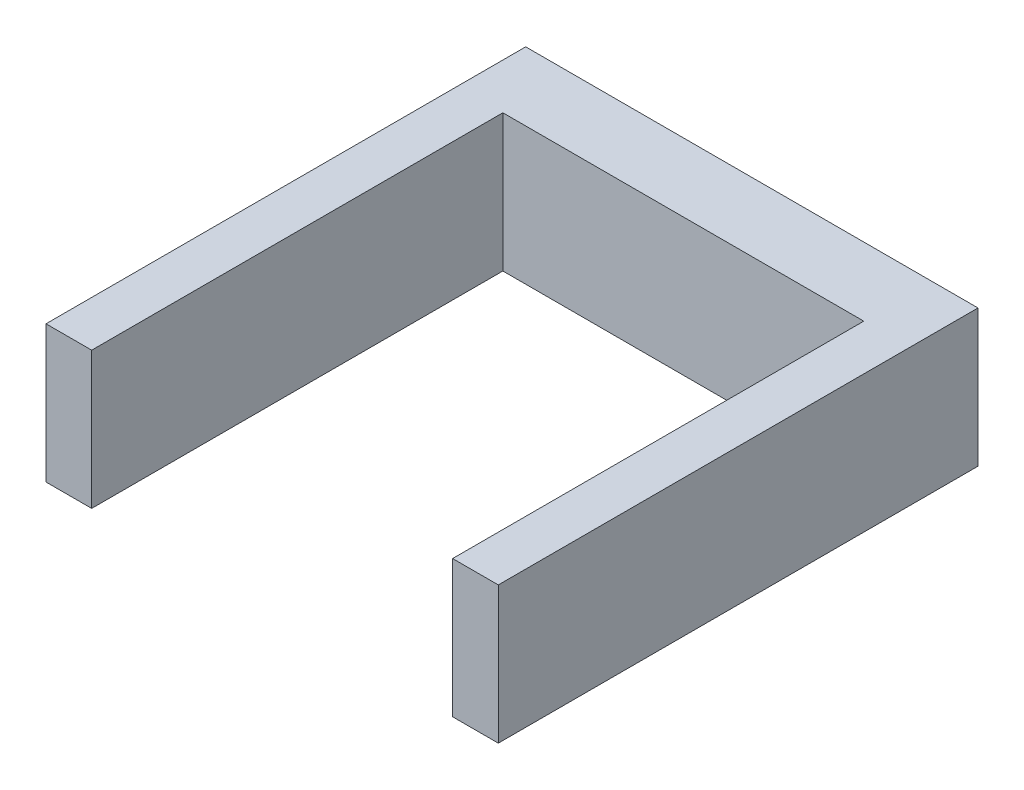
ISO-10303-21;
HEADER;
FILE_DESCRIPTION(('STEP AP214'),'2;1');
FILE_NAME('part.step','',(''),(''),'','','');
FILE_SCHEMA(('AUTOMOTIVE_DESIGN { 1 0 10303 214 1 1 1 1 }'));
ENDSEC;
DATA;
#1=APPLICATION_CONTEXT('core data for automotive mechanical design processes');
#2=APPLICATION_PROTOCOL_DEFINITION('international standard','automotive_design',2000,#1);
#3=PRODUCT_CONTEXT('',#1,'mechanical');
#4=PRODUCT('Part','Part','',(#3));
#5=PRODUCT_RELATED_PRODUCT_CATEGORY('part','',(#4));
#6=PRODUCT_DEFINITION_FORMATION('','',#4);
#7=PRODUCT_DEFINITION_CONTEXT('part definition',#1,'design');
#8=PRODUCT_DEFINITION('design','',#6,#7);
#9=PRODUCT_DEFINITION_SHAPE('','',#8);
#10=(LENGTH_UNIT() NAMED_UNIT(*) SI_UNIT(.MILLI.,.METRE.));
#11=(NAMED_UNIT(*) PLANE_ANGLE_UNIT() SI_UNIT($,.RADIAN.));
#12=(NAMED_UNIT(*) SI_UNIT($,.STERADIAN.) SOLID_ANGLE_UNIT());
#13=UNCERTAINTY_MEASURE_WITH_UNIT(LENGTH_MEASURE(1.E-05),#10,'distance_accuracy_value','');
#14=(GEOMETRIC_REPRESENTATION_CONTEXT(3) GLOBAL_UNCERTAINTY_ASSIGNED_CONTEXT((#13)) GLOBAL_UNIT_ASSIGNED_CONTEXT((#10,
#11,#12)) REPRESENTATION_CONTEXT('',''));
#15=CARTESIAN_POINT('',(0.,0.,0.));
#16=DIRECTION('',(0.,0.,1.));
#17=DIRECTION('',(1.,0.,0.));
#18=AXIS2_PLACEMENT_3D('',#15,#16,#17);
#19=CARTESIAN_POINT('',(14.0260273972603,6.,-12.3184931506849));
#20=DIRECTION('',(0.,0.,1.));
#21=DIRECTION('',(1.,0.,0.));
#22=AXIS2_PLACEMENT_3D('',#19,#20,#21);
#23=PLANE('',#22);
#24=DIRECTION('',(-1.,0.,0.));
#25=VECTOR('',#24,1.);
#26=CARTESIAN_POINT('',(14.0260273972603,0.,-12.3184931506849));
#27=LINE('',#26,#25);
#28=CARTESIAN_POINT('',(14.0260273972603,0.,-12.3184931506849));
#29=VERTEX_POINT('',#28);
#30=CARTESIAN_POINT('',(-5.77397260273973,0.,-12.3184931506849));
#31=VERTEX_POINT('',#30);
#32=EDGE_CURVE('E140',#29,#31,#27,.T.);
#33=ORIENTED_EDGE('',*,*,#32,.T.);
#34=DIRECTION('',(0.,-1.,0.));
#35=VECTOR('',#34,1.);
#36=CARTESIAN_POINT('',(-5.77397260273973,6.,-12.3184931506849));
#37=LINE('',#36,#35);
#38=CARTESIAN_POINT('',(-5.77397260273973,6.,-12.3184931506849));
#39=VERTEX_POINT('',#38);
#40=EDGE_CURVE('E11',#39,#31,#37,.T.);
#41=ORIENTED_EDGE('',*,*,#40,.F.);
#42=DIRECTION('',(-1.,0.,0.));
#43=VECTOR('',#42,1.);
#44=CARTESIAN_POINT('',(14.0260273972603,6.,-12.3184931506849));
#45=LINE('',#44,#43);
#46=CARTESIAN_POINT('',(14.0260273972603,6.,-12.3184931506849));
#47=VERTEX_POINT('',#46);
#48=EDGE_CURVE('E162',#47,#39,#45,.T.);
#49=ORIENTED_EDGE('',*,*,#48,.F.);
#50=DIRECTION('',(0.,-1.,0.));
#51=VECTOR('',#50,1.);
#52=CARTESIAN_POINT('',(14.0260273972603,6.,-12.3184931506849));
#53=LINE('',#52,#51);
#54=EDGE_CURVE('E136',#47,#29,#53,.T.);
#55=ORIENTED_EDGE('',*,*,#54,.T.);
#56=EDGE_LOOP('',(#33,#41,#49,#55));
#57=FACE_BOUND('',#56,.T.);
#58=ADVANCED_FACE('F39',(#57),#23,.F.);
#59=CARTESIAN_POINT('',(-5.77397260273973,6.,-12.3184931506849));
#60=DIRECTION('',(1.,0.,0.));
#61=DIRECTION('',(0.,0.,-1.));
#62=AXIS2_PLACEMENT_3D('',#59,#60,#61);
#63=PLANE('',#62);
#64=DIRECTION('',(0.,0.,1.));
#65=VECTOR('',#64,1.);
#66=CARTESIAN_POINT('',(-5.77397260273973,0.,-12.3184931506849));
#67=LINE('',#66,#65);
#68=CARTESIAN_POINT('',(-5.77397260273973,0.,8.68150684931507));
#69=VERTEX_POINT('',#68);
#70=EDGE_CURVE('E144',#31,#69,#67,.T.);
#71=ORIENTED_EDGE('',*,*,#70,.T.);
#72=DIRECTION('',(0.,-1.,0.));
#73=VECTOR('',#72,1.);
#74=CARTESIAN_POINT('',(-5.77397260273973,6.,8.68150684931507));
#75=LINE('',#74,#73);
#76=CARTESIAN_POINT('',(-5.77397260273973,6.,8.68150684931507));
#77=VERTEX_POINT('',#76);
#78=EDGE_CURVE('E48',#77,#69,#75,.T.);
#79=ORIENTED_EDGE('',*,*,#78,.F.);
#80=DIRECTION('',(0.,0.,1.));
#81=VECTOR('',#80,1.);
#82=CARTESIAN_POINT('',(-5.77397260273973,6.,-12.3184931506849));
#83=LINE('',#82,#81);
#84=EDGE_CURVE('E99',#39,#77,#83,.T.);
#85=ORIENTED_EDGE('',*,*,#84,.F.);
#86=ORIENTED_EDGE('',*,*,#40,.T.);
#87=EDGE_LOOP('',(#71,#79,#85,#86));
#88=FACE_BOUND('',#87,.T.);
#89=ADVANCED_FACE('F208',(#88),#63,.F.);
#90=CARTESIAN_POINT('',(-5.77397260273973,6.,8.68150684931507));
#91=DIRECTION('',(0.,0.,-1.));
#92=DIRECTION('',(-1.,0.,0.));
#93=AXIS2_PLACEMENT_3D('',#90,#91,#92);
#94=PLANE('',#93);
#95=DIRECTION('',(1.,0.,0.));
#96=VECTOR('',#95,1.);
#97=CARTESIAN_POINT('',(-5.77397260273973,0.,8.68150684931507));
#98=LINE('',#97,#96);
#99=CARTESIAN_POINT('',(-3.77397260273973,0.,8.68150684931507));
#100=VERTEX_POINT('',#99);
#101=EDGE_CURVE('E147',#69,#100,#98,.T.);
#102=ORIENTED_EDGE('',*,*,#101,.T.);
#103=DIRECTION('',(0.,-1.,0.));
#104=VECTOR('',#103,1.);
#105=CARTESIAN_POINT('',(-3.77397260273973,6.,8.68150684931507));
#106=LINE('',#105,#104);
#107=CARTESIAN_POINT('',(-3.77397260273973,6.,8.68150684931507));
#108=VERTEX_POINT('',#107);
#109=EDGE_CURVE('E173',#108,#100,#106,.T.);
#110=ORIENTED_EDGE('',*,*,#109,.F.);
#111=DIRECTION('',(1.,0.,0.));
#112=VECTOR('',#111,1.);
#113=CARTESIAN_POINT('',(-5.77397260273973,6.,8.68150684931507));
#114=LINE('',#113,#112);
#115=EDGE_CURVE('E183',#77,#108,#114,.T.);
#116=ORIENTED_EDGE('',*,*,#115,.F.);
#117=ORIENTED_EDGE('',*,*,#78,.T.);
#118=EDGE_LOOP('',(#102,#110,#116,#117));
#119=FACE_BOUND('',#118,.T.);
#120=ADVANCED_FACE('F181',(#119),#94,.F.);
#121=CARTESIAN_POINT('',(-3.77397260273973,6.,8.68150684931507));
#122=DIRECTION('',(-1.,0.,0.));
#123=DIRECTION('',(0.,0.,1.));
#124=AXIS2_PLACEMENT_3D('',#121,#122,#123);
#125=PLANE('',#124);
#126=DIRECTION('',(0.,0.,-1.));
#127=VECTOR('',#126,1.);
#128=CARTESIAN_POINT('',(-3.77397260273973,0.,8.68150684931507));
#129=LINE('',#128,#127);
#130=CARTESIAN_POINT('',(-3.77397260273973,0.,-9.31849315068493));
#131=VERTEX_POINT('',#130);
#132=EDGE_CURVE('E150',#100,#131,#129,.T.);
#133=ORIENTED_EDGE('',*,*,#132,.T.);
#134=DIRECTION('',(0.,-1.,0.));
#135=VECTOR('',#134,1.);
#136=CARTESIAN_POINT('',(-3.77397260273973,6.,-9.31849315068493));
#137=LINE('',#136,#135);
#138=CARTESIAN_POINT('',(-3.77397260273973,6.,-9.31849315068493));
#139=VERTEX_POINT('',#138);
#140=EDGE_CURVE('E169',#139,#131,#137,.T.);
#141=ORIENTED_EDGE('',*,*,#140,.F.);
#142=DIRECTION('',(0.,0.,-1.));
#143=VECTOR('',#142,1.);
#144=CARTESIAN_POINT('',(-3.77397260273973,6.,8.68150684931507));
#145=LINE('',#144,#143);
#146=EDGE_CURVE('E196',#108,#139,#145,.T.);
#147=ORIENTED_EDGE('',*,*,#146,.F.);
#148=ORIENTED_EDGE('',*,*,#109,.T.);
#149=EDGE_LOOP('',(#133,#141,#147,#148));
#150=FACE_BOUND('',#149,.T.);
#151=ADVANCED_FACE('F191',(#150),#125,.F.);
#152=CARTESIAN_POINT('',(-3.77397260273973,6.,-9.31849315068493));
#153=DIRECTION('',(0.,0.,-1.));
#154=DIRECTION('',(-1.,0.,0.));
#155=AXIS2_PLACEMENT_3D('',#152,#153,#154);
#156=PLANE('',#155);
#157=DIRECTION('',(1.,0.,0.));
#158=VECTOR('',#157,1.);
#159=CARTESIAN_POINT('',(-3.77397260273973,0.,-9.31849315068493));
#160=LINE('',#159,#158);
#161=CARTESIAN_POINT('',(12.0260273972603,0.,-9.31849315068493));
#162=VERTEX_POINT('',#161);
#163=EDGE_CURVE('E153',#131,#162,#160,.T.);
#164=ORIENTED_EDGE('',*,*,#163,.T.);
#165=DIRECTION('',(0.,-1.,0.));
#166=VECTOR('',#165,1.);
#167=CARTESIAN_POINT('',(12.0260273972603,6.,-9.31849315068493));
#168=LINE('',#167,#166);
#169=CARTESIAN_POINT('',(12.0260273972603,6.,-9.31849315068493));
#170=VERTEX_POINT('',#169);
#171=EDGE_CURVE('E129',#170,#162,#168,.T.);
#172=ORIENTED_EDGE('',*,*,#171,.F.);
#173=DIRECTION('',(1.,0.,0.));
#174=VECTOR('',#173,1.);
#175=CARTESIAN_POINT('',(-3.77397260273973,6.,-9.31849315068493));
#176=LINE('',#175,#174);
#177=EDGE_CURVE('E118',#139,#170,#176,.T.);
#178=ORIENTED_EDGE('',*,*,#177,.F.);
#179=ORIENTED_EDGE('',*,*,#140,.T.);
#180=EDGE_LOOP('',(#164,#172,#178,#179));
#181=FACE_BOUND('',#180,.T.);
#182=ADVANCED_FACE('F194',(#181),#156,.F.);
#183=CARTESIAN_POINT('',(12.0260273972603,6.,-9.31849315068493));
#184=DIRECTION('',(1.,0.,0.));
#185=DIRECTION('',(0.,0.,-1.));
#186=AXIS2_PLACEMENT_3D('',#183,#184,#185);
#187=PLANE('',#186);
#188=DIRECTION('',(0.,0.,1.));
#189=VECTOR('',#188,1.);
#190=CARTESIAN_POINT('',(12.0260273972603,0.,-9.31849315068493));
#191=LINE('',#190,#189);
#192=CARTESIAN_POINT('',(12.0260273972603,0.,8.68150684931507));
#193=VERTEX_POINT('',#192);
#194=EDGE_CURVE('E127',#162,#193,#191,.T.);
#195=ORIENTED_EDGE('',*,*,#194,.T.);
#196=DIRECTION('',(0.,-1.,0.));
#197=VECTOR('',#196,1.);
#198=CARTESIAN_POINT('',(12.0260273972603,6.,8.68150684931507));
#199=LINE('',#198,#197);
#200=CARTESIAN_POINT('',(12.0260273972603,6.,8.68150684931507));
#201=VERTEX_POINT('',#200);
#202=EDGE_CURVE('E124',#201,#193,#199,.T.);
#203=ORIENTED_EDGE('',*,*,#202,.F.);
#204=DIRECTION('',(0.,0.,1.));
#205=VECTOR('',#204,1.);
#206=CARTESIAN_POINT('',(12.0260273972603,6.,-9.31849315068493));
#207=LINE('',#206,#205);
#208=EDGE_CURVE('E112',#170,#201,#207,.T.);
#209=ORIENTED_EDGE('',*,*,#208,.F.);
#210=ORIENTED_EDGE('',*,*,#171,.T.);
#211=EDGE_LOOP('',(#195,#203,#209,#210));
#212=FACE_BOUND('',#211,.T.);
#213=ADVANCED_FACE('F125',(#212),#187,.F.);
#214=CARTESIAN_POINT('',(12.0260273972603,6.,8.68150684931507));
#215=DIRECTION('',(0.,0.,-1.));
#216=DIRECTION('',(-1.,0.,0.));
#217=AXIS2_PLACEMENT_3D('',#214,#215,#216);
#218=PLANE('',#217);
#219=DIRECTION('',(1.,0.,0.));
#220=VECTOR('',#219,1.);
#221=CARTESIAN_POINT('',(12.0260273972603,0.,8.68150684931507));
#222=LINE('',#221,#220);
#223=CARTESIAN_POINT('',(14.0260273972603,0.,8.68150684931507));
#224=VERTEX_POINT('',#223);
#225=EDGE_CURVE('E85',#193,#224,#222,.T.);
#226=ORIENTED_EDGE('',*,*,#225,.T.);
#227=DIRECTION('',(0.,-1.,0.));
#228=VECTOR('',#227,1.);
#229=CARTESIAN_POINT('',(14.0260273972603,6.,8.68150684931507));
#230=LINE('',#229,#228);
#231=CARTESIAN_POINT('',(14.0260273972603,6.,8.68150684931507));
#232=VERTEX_POINT('',#231);
#233=EDGE_CURVE('E130',#232,#224,#230,.T.);
#234=ORIENTED_EDGE('',*,*,#233,.F.);
#235=DIRECTION('',(1.,0.,0.));
#236=VECTOR('',#235,1.);
#237=CARTESIAN_POINT('',(12.0260273972603,6.,8.68150684931507));
#238=LINE('',#237,#236);
#239=EDGE_CURVE('E116',#201,#232,#238,.T.);
#240=ORIENTED_EDGE('',*,*,#239,.F.);
#241=ORIENTED_EDGE('',*,*,#202,.T.);
#242=EDGE_LOOP('',(#226,#234,#240,#241));
#243=FACE_BOUND('',#242,.T.);
#244=ADVANCED_FACE('F132',(#243),#218,.F.);
#245=CARTESIAN_POINT('',(14.0260273972603,6.,8.68150684931507));
#246=DIRECTION('',(-1.,0.,0.));
#247=DIRECTION('',(0.,0.,1.));
#248=AXIS2_PLACEMENT_3D('',#245,#246,#247);
#249=PLANE('',#248);
#250=DIRECTION('',(0.,0.,-1.));
#251=VECTOR('',#250,1.);
#252=CARTESIAN_POINT('',(14.0260273972603,0.,8.68150684931507));
#253=LINE('',#252,#251);
#254=EDGE_CURVE('E91',#224,#29,#253,.T.);
#255=ORIENTED_EDGE('',*,*,#254,.T.);
#256=ORIENTED_EDGE('',*,*,#54,.F.);
#257=DIRECTION('',(0.,0.,-1.));
#258=VECTOR('',#257,1.);
#259=CARTESIAN_POINT('',(14.0260273972603,6.,8.68150684931507));
#260=LINE('',#259,#258);
#261=EDGE_CURVE('E56',#232,#47,#260,.T.);
#262=ORIENTED_EDGE('',*,*,#261,.F.);
#263=ORIENTED_EDGE('',*,*,#233,.T.);
#264=EDGE_LOOP('',(#255,#256,#262,#263));
#265=FACE_BOUND('',#264,.T.);
#266=ADVANCED_FACE('F224',(#265),#249,.F.);
#267=CARTESIAN_POINT('',(0.,6.,0.));
#268=DIRECTION('',(0.,1.,0.));
#269=DIRECTION('',(0.,0.,1.));
#270=AXIS2_PLACEMENT_3D('',#267,#268,#269);
#271=PLANE('',#270);
#272=ORIENTED_EDGE('',*,*,#48,.T.);
#273=ORIENTED_EDGE('',*,*,#84,.T.);
#274=ORIENTED_EDGE('',*,*,#115,.T.);
#275=ORIENTED_EDGE('',*,*,#146,.T.);
#276=ORIENTED_EDGE('',*,*,#177,.T.);
#277=ORIENTED_EDGE('',*,*,#208,.T.);
#278=ORIENTED_EDGE('',*,*,#239,.T.);
#279=ORIENTED_EDGE('',*,*,#261,.T.);
#280=EDGE_LOOP('',(#272,#273,#274,#275,#276,#277,#278,#279));
#281=FACE_BOUND('',#280,.T.);
#282=ADVANCED_FACE('F114',(#281),#271,.T.);
#283=CARTESIAN_POINT('',(0.,0.,0.));
#284=DIRECTION('',(0.,1.,0.));
#285=DIRECTION('',(0.,0.,1.));
#286=AXIS2_PLACEMENT_3D('',#283,#284,#285);
#287=PLANE('',#286);
#288=ORIENTED_EDGE('',*,*,#32,.F.);
#289=ORIENTED_EDGE('',*,*,#254,.F.);
#290=ORIENTED_EDGE('',*,*,#225,.F.);
#291=ORIENTED_EDGE('',*,*,#194,.F.);
#292=ORIENTED_EDGE('',*,*,#163,.F.);
#293=ORIENTED_EDGE('',*,*,#132,.F.);
#294=ORIENTED_EDGE('',*,*,#101,.F.);
#295=ORIENTED_EDGE('',*,*,#70,.F.);
#296=EDGE_LOOP('',(#288,#289,#290,#291,#292,#293,#294,#295));
#297=FACE_BOUND('',#296,.T.);
#298=ADVANCED_FACE('F187',(#297),#287,.F.);
#299=CLOSED_SHELL('',(#58,#89,#120,#151,#182,#213,#244,#266,#282,#298));
#300=MANIFOLD_SOLID_BREP('B2',#299);
#301=ADVANCED_BREP_SHAPE_REPRESENTATION('',(#18,#300),#14);
#302=SHAPE_DEFINITION_REPRESENTATION(#9,#301);
ENDSEC;
END-ISO-10303-21;
